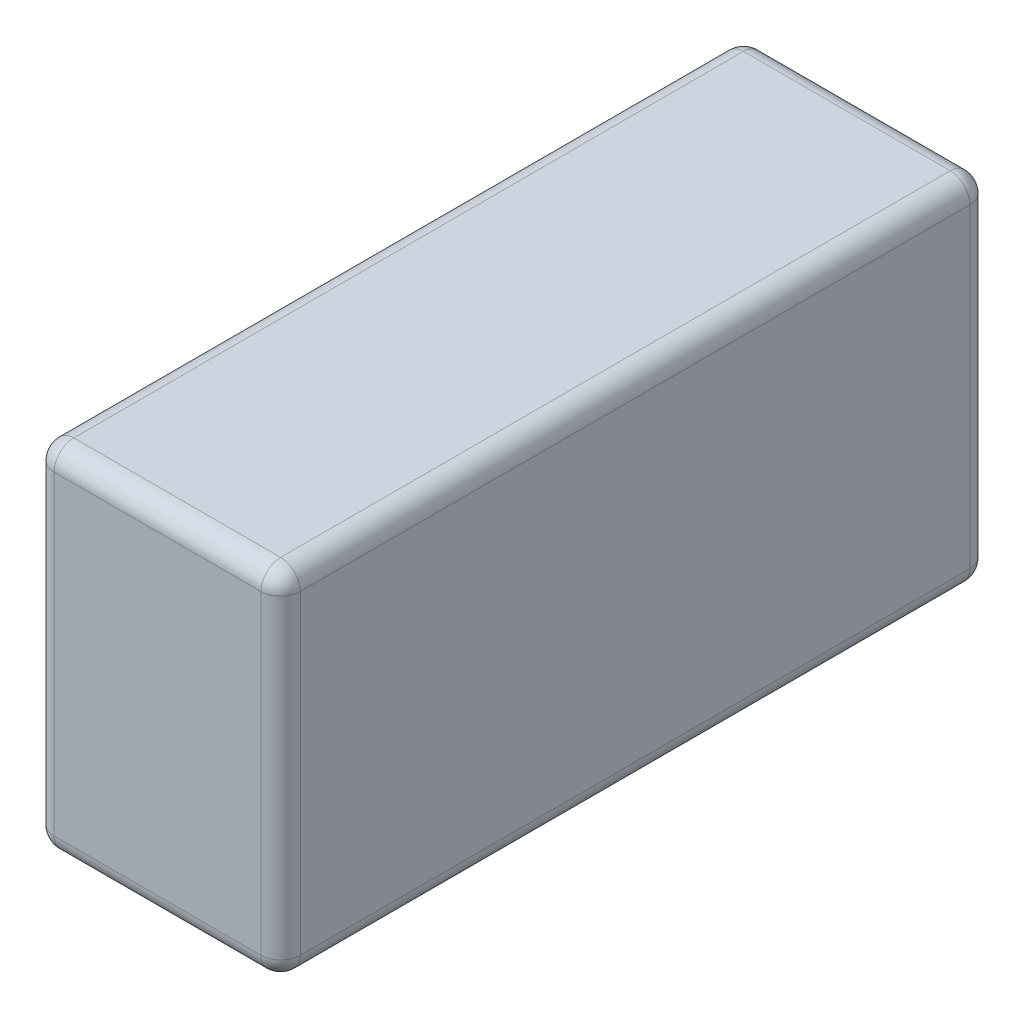
ISO-10303-21;
HEADER;
FILE_DESCRIPTION(('STEP AP214'),'2;1');
FILE_NAME('part.step','',(''),(''),'','','');
FILE_SCHEMA(('AUTOMOTIVE_DESIGN { 1 0 10303 214 1 1 1 1 }'));
ENDSEC;
DATA;
#1=APPLICATION_CONTEXT('core data for automotive mechanical design processes');
#2=APPLICATION_PROTOCOL_DEFINITION('international standard','automotive_design',2000,#1);
#3=PRODUCT_CONTEXT('',#1,'mechanical');
#4=PRODUCT('Part','Part','',(#3));
#5=PRODUCT_RELATED_PRODUCT_CATEGORY('part','',(#4));
#6=PRODUCT_DEFINITION_FORMATION('','',#4);
#7=PRODUCT_DEFINITION_CONTEXT('part definition',#1,'design');
#8=PRODUCT_DEFINITION('design','',#6,#7);
#9=PRODUCT_DEFINITION_SHAPE('','',#8);
#10=(LENGTH_UNIT() NAMED_UNIT(*) SI_UNIT(.MILLI.,.METRE.));
#11=(NAMED_UNIT(*) PLANE_ANGLE_UNIT() SI_UNIT($,.RADIAN.));
#12=(NAMED_UNIT(*) SI_UNIT($,.STERADIAN.) SOLID_ANGLE_UNIT());
#13=UNCERTAINTY_MEASURE_WITH_UNIT(LENGTH_MEASURE(1.E-05),#10,'distance_accuracy_value','');
#14=(GEOMETRIC_REPRESENTATION_CONTEXT(3) GLOBAL_UNCERTAINTY_ASSIGNED_CONTEXT((#13)) GLOBAL_UNIT_ASSIGNED_CONTEXT((#10,
#11,#12)) REPRESENTATION_CONTEXT('',''));
#15=CARTESIAN_POINT('',(0.,0.,0.));
#16=DIRECTION('',(0.,0.,1.));
#17=DIRECTION('',(1.,0.,0.));
#18=AXIS2_PLACEMENT_3D('',#15,#16,#17);
#19=CARTESIAN_POINT('',(12.5,18.,72.));
#20=DIRECTION('',(-1.,0.,0.));
#21=DIRECTION('',(0.,-1.,0.));
#22=AXIS2_PLACEMENT_3D('',#19,#20,#21);
#23=PLANE('',#22);
#24=DIRECTION('',(0.,0.,-1.));
#25=VECTOR('',#24,1.);
#26=CARTESIAN_POINT('',(12.5,16.,72.));
#27=LINE('',#26,#25);
#28=CARTESIAN_POINT('',(12.5,16.,2.));
#29=VERTEX_POINT('',#28);
#30=CARTESIAN_POINT('',(12.5,16.,70.));
#31=VERTEX_POINT('',#30);
#32=EDGE_CURVE('E209',#29,#31,#27,.F.);
#33=ORIENTED_EDGE('',*,*,#32,.T.);
#34=DIRECTION('',(0.,1.,0.));
#35=VECTOR('',#34,1.);
#36=CARTESIAN_POINT('',(12.5,-18.,70.));
#37=LINE('',#36,#35);
#38=CARTESIAN_POINT('',(12.5,-16.,70.));
#39=VERTEX_POINT('',#38);
#40=EDGE_CURVE('E218',#31,#39,#37,.F.);
#41=ORIENTED_EDGE('',*,*,#40,.T.);
#42=DIRECTION('',(0.,0.,-1.));
#43=VECTOR('',#42,1.);
#44=CARTESIAN_POINT('',(12.5,-16.,72.));
#45=LINE('',#44,#43);
#46=CARTESIAN_POINT('',(12.5,-16.,2.));
#47=VERTEX_POINT('',#46);
#48=EDGE_CURVE('E215',#39,#47,#45,.T.);
#49=ORIENTED_EDGE('',*,*,#48,.T.);
#50=DIRECTION('',(0.,1.,0.));
#51=VECTOR('',#50,1.);
#52=CARTESIAN_POINT('',(12.5,18.,2.));
#53=LINE('',#52,#51);
#54=EDGE_CURVE('E212',#47,#29,#53,.T.);
#55=ORIENTED_EDGE('',*,*,#54,.T.);
#56=EDGE_LOOP('',(#33,#41,#49,#55));
#57=FACE_BOUND('',#56,.T.);
#58=ADVANCED_FACE('F39',(#57),#23,.F.);
#59=CARTESIAN_POINT('',(-12.5,18.,72.));
#60=DIRECTION('',(0.,-1.,0.));
#61=DIRECTION('',(0.,0.,-1.));
#62=AXIS2_PLACEMENT_3D('',#59,#60,#61);
#63=PLANE('',#62);
#64=DIRECTION('',(0.,0.,-1.));
#65=VECTOR('',#64,1.);
#66=CARTESIAN_POINT('',(-10.5,18.,72.));
#67=LINE('',#66,#65);
#68=CARTESIAN_POINT('',(-10.5,18.,2.));
#69=VERTEX_POINT('',#68);
#70=CARTESIAN_POINT('',(-10.5,18.,70.));
#71=VERTEX_POINT('',#70);
#72=EDGE_CURVE('E202',#69,#71,#67,.F.);
#73=ORIENTED_EDGE('',*,*,#72,.T.);
#74=DIRECTION('',(-1.,0.,0.));
#75=VECTOR('',#74,1.);
#76=CARTESIAN_POINT('',(12.5,18.,70.));
#77=LINE('',#76,#75);
#78=CARTESIAN_POINT('',(10.5,18.,70.));
#79=VERTEX_POINT('',#78);
#80=EDGE_CURVE('E205',#71,#79,#77,.F.);
#81=ORIENTED_EDGE('',*,*,#80,.T.);
#82=DIRECTION('',(0.,0.,-1.));
#83=VECTOR('',#82,1.);
#84=CARTESIAN_POINT('',(10.5,18.,72.));
#85=LINE('',#84,#83);
#86=CARTESIAN_POINT('',(10.5,18.,2.));
#87=VERTEX_POINT('',#86);
#88=EDGE_CURVE('E199',#79,#87,#85,.T.);
#89=ORIENTED_EDGE('',*,*,#88,.T.);
#90=DIRECTION('',(-1.,0.,0.));
#91=VECTOR('',#90,1.);
#92=CARTESIAN_POINT('',(-12.5,18.,2.));
#93=LINE('',#92,#91);
#94=EDGE_CURVE('E196',#87,#69,#93,.T.);
#95=ORIENTED_EDGE('',*,*,#94,.T.);
#96=EDGE_LOOP('',(#73,#81,#89,#95));
#97=FACE_BOUND('',#96,.T.);
#98=ADVANCED_FACE('F351',(#97),#63,.F.);
#99=CARTESIAN_POINT('',(-12.5,18.,72.));
#100=DIRECTION('',(1.,0.,0.));
#101=DIRECTION('',(0.,1.,0.));
#102=AXIS2_PLACEMENT_3D('',#99,#100,#101);
#103=PLANE('',#102);
#104=DIRECTION('',(0.,0.,-1.));
#105=VECTOR('',#104,1.);
#106=CARTESIAN_POINT('',(-12.5,-16.,72.));
#107=LINE('',#106,#105);
#108=CARTESIAN_POINT('',(-12.5,-16.,2.));
#109=VERTEX_POINT('',#108);
#110=CARTESIAN_POINT('',(-12.5,-16.,70.));
#111=VERTEX_POINT('',#110);
#112=EDGE_CURVE('E189',#109,#111,#107,.F.);
#113=ORIENTED_EDGE('',*,*,#112,.T.);
#114=DIRECTION('',(0.,-1.,0.));
#115=VECTOR('',#114,1.);
#116=CARTESIAN_POINT('',(-12.5,18.,70.));
#117=LINE('',#116,#115);
#118=CARTESIAN_POINT('',(-12.5,16.,70.));
#119=VERTEX_POINT('',#118);
#120=EDGE_CURVE('E192',#111,#119,#117,.F.);
#121=ORIENTED_EDGE('',*,*,#120,.T.);
#122=DIRECTION('',(0.,0.,-1.));
#123=VECTOR('',#122,1.);
#124=CARTESIAN_POINT('',(-12.5,16.,72.));
#125=LINE('',#124,#123);
#126=CARTESIAN_POINT('',(-12.5,16.,2.));
#127=VERTEX_POINT('',#126);
#128=EDGE_CURVE('E186',#119,#127,#125,.T.);
#129=ORIENTED_EDGE('',*,*,#128,.T.);
#130=DIRECTION('',(0.,-1.,0.));
#131=VECTOR('',#130,1.);
#132=CARTESIAN_POINT('',(-12.5,18.,2.));
#133=LINE('',#132,#131);
#134=EDGE_CURVE('E183',#127,#109,#133,.T.);
#135=ORIENTED_EDGE('',*,*,#134,.T.);
#136=EDGE_LOOP('',(#113,#121,#129,#135));
#137=FACE_BOUND('',#136,.T.);
#138=ADVANCED_FACE('F337',(#137),#103,.F.);
#139=CARTESIAN_POINT('',(-12.5,-18.,72.));
#140=DIRECTION('',(0.,1.,0.));
#141=DIRECTION('',(0.,0.,1.));
#142=AXIS2_PLACEMENT_3D('',#139,#140,#141);
#143=PLANE('',#142);
#144=DIRECTION('',(0.,0.,-1.));
#145=VECTOR('',#144,1.);
#146=CARTESIAN_POINT('',(10.5,-18.,72.));
#147=LINE('',#146,#145);
#148=CARTESIAN_POINT('',(10.5,-18.,2.));
#149=VERTEX_POINT('',#148);
#150=CARTESIAN_POINT('',(10.5,-18.,70.));
#151=VERTEX_POINT('',#150);
#152=EDGE_CURVE('E167',#149,#151,#147,.F.);
#153=ORIENTED_EDGE('',*,*,#152,.T.);
#154=DIRECTION('',(1.,0.,0.));
#155=VECTOR('',#154,1.);
#156=CARTESIAN_POINT('',(-12.5,-18.,70.));
#157=LINE('',#156,#155);
#158=CARTESIAN_POINT('',(-10.5,-18.,70.));
#159=VERTEX_POINT('',#158);
#160=EDGE_CURVE('E135',#151,#159,#157,.F.);
#161=ORIENTED_EDGE('',*,*,#160,.T.);
#162=DIRECTION('',(0.,0.,-1.));
#163=VECTOR('',#162,1.);
#164=CARTESIAN_POINT('',(-10.5,-18.,72.));
#165=LINE('',#164,#163);
#166=CARTESIAN_POINT('',(-10.5,-18.,2.));
#167=VERTEX_POINT('',#166);
#168=EDGE_CURVE('E178',#159,#167,#165,.T.);
#169=ORIENTED_EDGE('',*,*,#168,.T.);
#170=DIRECTION('',(1.,0.,0.));
#171=VECTOR('',#170,1.);
#172=CARTESIAN_POINT('',(-12.5,-18.,2.));
#173=LINE('',#172,#171);
#174=EDGE_CURVE('E171',#167,#149,#173,.T.);
#175=ORIENTED_EDGE('',*,*,#174,.T.);
#176=EDGE_LOOP('',(#153,#161,#169,#175));
#177=FACE_BOUND('',#176,.T.);
#178=ADVANCED_FACE('F372',(#177),#143,.F.);
#179=CARTESIAN_POINT('',(0.,0.,72.));
#180=DIRECTION('',(0.,0.,1.));
#181=DIRECTION('',(1.,0.,0.));
#182=AXIS2_PLACEMENT_3D('',#179,#180,#181);
#183=PLANE('',#182);
#184=DIRECTION('',(0.,-1.,0.));
#185=VECTOR('',#184,1.);
#186=CARTESIAN_POINT('',(-10.5,-18.,72.));
#187=LINE('',#186,#185);
#188=CARTESIAN_POINT('',(-10.5,16.,72.));
#189=VERTEX_POINT('',#188);
#190=CARTESIAN_POINT('',(-10.5,-16.,72.));
#191=VERTEX_POINT('',#190);
#192=EDGE_CURVE('E164',#189,#191,#187,.T.);
#193=ORIENTED_EDGE('',*,*,#192,.T.);
#194=DIRECTION('',(1.,0.,0.));
#195=VECTOR('',#194,1.);
#196=CARTESIAN_POINT('',(12.5,-16.,72.));
#197=LINE('',#196,#195);
#198=CARTESIAN_POINT('',(10.5,-16.,72.));
#199=VERTEX_POINT('',#198);
#200=EDGE_CURVE('E133',#191,#199,#197,.T.);
#201=ORIENTED_EDGE('',*,*,#200,.T.);
#202=DIRECTION('',(0.,1.,0.));
#203=VECTOR('',#202,1.);
#204=CARTESIAN_POINT('',(10.5,18.,72.));
#205=LINE('',#204,#203);
#206=CARTESIAN_POINT('',(10.5,16.,72.));
#207=VERTEX_POINT('',#206);
#208=EDGE_CURVE('E153',#199,#207,#205,.T.);
#209=ORIENTED_EDGE('',*,*,#208,.T.);
#210=DIRECTION('',(-1.,0.,0.));
#211=VECTOR('',#210,1.);
#212=CARTESIAN_POINT('',(-12.5,16.,72.));
#213=LINE('',#212,#211);
#214=EDGE_CURVE('E160',#207,#189,#213,.T.);
#215=ORIENTED_EDGE('',*,*,#214,.T.);
#216=EDGE_LOOP('',(#193,#201,#209,#215));
#217=FACE_BOUND('',#216,.T.);
#218=ADVANCED_FACE('F162',(#217),#183,.T.);
#219=CARTESIAN_POINT('',(0.,0.,0.));
#220=DIRECTION('',(0.,0.,1.));
#221=DIRECTION('',(1.,0.,0.));
#222=AXIS2_PLACEMENT_3D('',#219,#220,#221);
#223=PLANE('',#222);
#224=DIRECTION('',(1.,0.,0.));
#225=VECTOR('',#224,1.);
#226=CARTESIAN_POINT('',(0.,-16.,0.));
#227=LINE('',#226,#225);
#228=CARTESIAN_POINT('',(10.5,-16.,0.));
#229=VERTEX_POINT('',#228);
#230=CARTESIAN_POINT('',(-10.5,-16.,0.));
#231=VERTEX_POINT('',#230);
#232=EDGE_CURVE('E49',#229,#231,#227,.F.);
#233=ORIENTED_EDGE('',*,*,#232,.T.);
#234=DIRECTION('',(0.,-1.,0.));
#235=VECTOR('',#234,1.);
#236=CARTESIAN_POINT('',(-10.5,0.,0.));
#237=LINE('',#236,#235);
#238=CARTESIAN_POINT('',(-10.5,16.,0.));
#239=VERTEX_POINT('',#238);
#240=EDGE_CURVE('E11',#231,#239,#237,.F.);
#241=ORIENTED_EDGE('',*,*,#240,.T.);
#242=DIRECTION('',(-1.,0.,0.));
#243=VECTOR('',#242,1.);
#244=CARTESIAN_POINT('',(0.,16.,0.));
#245=LINE('',#244,#243);
#246=CARTESIAN_POINT('',(10.5,16.,0.));
#247=VERTEX_POINT('',#246);
#248=EDGE_CURVE('E222',#239,#247,#245,.F.);
#249=ORIENTED_EDGE('',*,*,#248,.T.);
#250=DIRECTION('',(0.,1.,0.));
#251=VECTOR('',#250,1.);
#252=CARTESIAN_POINT('',(10.5,0.,0.));
#253=LINE('',#252,#251);
#254=EDGE_CURVE('E60',#247,#229,#253,.F.);
#255=ORIENTED_EDGE('',*,*,#254,.T.);
#256=EDGE_LOOP('',(#233,#241,#249,#255));
#257=FACE_BOUND('',#256,.T.);
#258=ADVANCED_FACE('F317',(#257),#223,.F.);
#259=CARTESIAN_POINT('',(-12.5,16.,2.));
#260=DIRECTION('',(-1.,0.,0.));
#261=DIRECTION('',(0.,0.,1.));
#262=AXIS2_PLACEMENT_3D('',#259,#260,#261);
#263=CYLINDRICAL_SURFACE('',#262,2.);
#264=CARTESIAN_POINT('',(-10.5,16.,2.));
#265=DIRECTION('',(-1.,0.,0.));
#266=DIRECTION('',(0.,0.,1.));
#267=AXIS2_PLACEMENT_3D('',#264,#265,#266);
#268=CIRCLE('',#267,2.);
#269=EDGE_CURVE('E43',#69,#239,#268,.T.);
#270=ORIENTED_EDGE('',*,*,#269,.F.);
#271=ORIENTED_EDGE('',*,*,#94,.F.);
#272=CARTESIAN_POINT('',(10.5,16.,2.));
#273=DIRECTION('',(1.,0.,0.));
#274=DIRECTION('',(0.,1.,0.));
#275=AXIS2_PLACEMENT_3D('',#272,#273,#274);
#276=CIRCLE('',#275,2.);
#277=EDGE_CURVE('E298',#247,#87,#276,.T.);
#278=ORIENTED_EDGE('',*,*,#277,.F.);
#279=ORIENTED_EDGE('',*,*,#248,.F.);
#280=EDGE_LOOP('',(#270,#271,#278,#279));
#281=FACE_BOUND('',#280,.T.);
#282=ADVANCED_FACE('F41',(#281),#263,.T.);
#283=CARTESIAN_POINT('',(-10.5,16.,2.));
#284=DIRECTION('',(0.,0.,1.));
#285=DIRECTION('',(1.,0.,0.));
#286=AXIS2_PLACEMENT_3D('',#283,#284,#285);
#287=SPHERICAL_SURFACE('',#286,2.);
#288=CARTESIAN_POINT('',(-10.5,16.,2.));
#289=DIRECTION('',(0.,0.,-1.));
#290=DIRECTION('',(-1.,0.,0.));
#291=AXIS2_PLACEMENT_3D('',#288,#289,#290);
#292=CIRCLE('',#291,2.);
#293=EDGE_CURVE('E292',#69,#127,#292,.F.);
#294=ORIENTED_EDGE('',*,*,#293,.F.);
#295=ORIENTED_EDGE('',*,*,#269,.T.);
#296=CARTESIAN_POINT('',(-10.5,16.,2.));
#297=DIRECTION('',(0.,1.,0.));
#298=DIRECTION('',(0.,0.,1.));
#299=AXIS2_PLACEMENT_3D('',#296,#297,#298);
#300=CIRCLE('',#299,2.);
#301=EDGE_CURVE('E296',#127,#239,#300,.F.);
#302=ORIENTED_EDGE('',*,*,#301,.F.);
#303=EDGE_LOOP('',(#294,#295,#302));
#304=FACE_BOUND('',#303,.T.);
#305=ADVANCED_FACE('F312',(#304),#287,.T.);
#306=CARTESIAN_POINT('',(10.5,16.,2.));
#307=DIRECTION('',(0.,0.,1.));
#308=DIRECTION('',(1.,0.,0.));
#309=AXIS2_PLACEMENT_3D('',#306,#307,#308);
#310=SPHERICAL_SURFACE('',#309,2.);
#311=CARTESIAN_POINT('',(10.5,16.,2.));
#312=DIRECTION('',(0.,1.,0.));
#313=DIRECTION('',(0.,0.,1.));
#314=AXIS2_PLACEMENT_3D('',#311,#312,#313);
#315=CIRCLE('',#314,2.);
#316=EDGE_CURVE('E284',#247,#29,#315,.F.);
#317=ORIENTED_EDGE('',*,*,#316,.F.);
#318=ORIENTED_EDGE('',*,*,#277,.T.);
#319=CARTESIAN_POINT('',(10.5,16.,2.));
#320=DIRECTION('',(0.,0.,-1.));
#321=DIRECTION('',(-1.,0.,0.));
#322=AXIS2_PLACEMENT_3D('',#319,#320,#321);
#323=CIRCLE('',#322,2.);
#324=EDGE_CURVE('E288',#29,#87,#323,.F.);
#325=ORIENTED_EDGE('',*,*,#324,.F.);
#326=EDGE_LOOP('',(#317,#318,#325));
#327=FACE_BOUND('',#326,.T.);
#328=ADVANCED_FACE('F361',(#327),#310,.T.);
#329=CARTESIAN_POINT('',(-10.5,18.,2.));
#330=DIRECTION('',(0.,-1.,0.));
#331=DIRECTION('',(1.,0.,0.));
#332=AXIS2_PLACEMENT_3D('',#329,#330,#331);
#333=CYLINDRICAL_SURFACE('',#332,2.);
#334=ORIENTED_EDGE('',*,*,#301,.T.);
#335=ORIENTED_EDGE('',*,*,#240,.F.);
#336=CARTESIAN_POINT('',(-10.5,-16.,2.));
#337=DIRECTION('',(0.,-1.,0.));
#338=DIRECTION('',(0.,0.,-1.));
#339=AXIS2_PLACEMENT_3D('',#336,#337,#338);
#340=CIRCLE('',#339,2.);
#341=EDGE_CURVE('E276',#109,#231,#340,.T.);
#342=ORIENTED_EDGE('',*,*,#341,.F.);
#343=ORIENTED_EDGE('',*,*,#134,.F.);
#344=EDGE_LOOP('',(#334,#335,#342,#343));
#345=FACE_BOUND('',#344,.T.);
#346=ADVANCED_FACE('F321',(#345),#333,.T.);
#347=CARTESIAN_POINT('',(-10.5,16.,72.));
#348=DIRECTION('',(0.,0.,-1.));
#349=DIRECTION('',(-1.,0.,0.));
#350=AXIS2_PLACEMENT_3D('',#347,#348,#349);
#351=CYLINDRICAL_SURFACE('',#350,2.);
#352=ORIENTED_EDGE('',*,*,#293,.T.);
#353=ORIENTED_EDGE('',*,*,#128,.F.);
#354=CARTESIAN_POINT('',(-10.5,16.,70.));
#355=DIRECTION('',(0.,0.,1.));
#356=DIRECTION('',(1.,0.,0.));
#357=AXIS2_PLACEMENT_3D('',#354,#355,#356);
#358=CIRCLE('',#357,2.);
#359=EDGE_CURVE('E272',#71,#119,#358,.T.);
#360=ORIENTED_EDGE('',*,*,#359,.F.);
#361=ORIENTED_EDGE('',*,*,#72,.F.);
#362=EDGE_LOOP('',(#352,#353,#360,#361));
#363=FACE_BOUND('',#362,.T.);
#364=ADVANCED_FACE('F348',(#363),#351,.T.);
#365=CARTESIAN_POINT('',(0.,16.,70.));
#366=DIRECTION('',(1.,0.,0.));
#367=DIRECTION('',(0.,0.,-1.));
#368=AXIS2_PLACEMENT_3D('',#365,#366,#367);
#369=CYLINDRICAL_SURFACE('',#368,2.);
#370=CARTESIAN_POINT('',(10.5,16.,70.));
#371=DIRECTION('',(1.,0.,0.));
#372=DIRECTION('',(0.,0.,-1.));
#373=AXIS2_PLACEMENT_3D('',#370,#371,#372);
#374=CIRCLE('',#373,2.);
#375=EDGE_CURVE('E264',#79,#207,#374,.T.);
#376=ORIENTED_EDGE('',*,*,#375,.F.);
#377=ORIENTED_EDGE('',*,*,#80,.F.);
#378=CARTESIAN_POINT('',(-10.5,16.,70.));
#379=DIRECTION('',(-1.,0.,0.));
#380=DIRECTION('',(0.,0.,1.));
#381=AXIS2_PLACEMENT_3D('',#378,#379,#380);
#382=CIRCLE('',#381,2.);
#383=EDGE_CURVE('E268',#189,#71,#382,.T.);
#384=ORIENTED_EDGE('',*,*,#383,.F.);
#385=ORIENTED_EDGE('',*,*,#214,.F.);
#386=EDGE_LOOP('',(#376,#377,#384,#385));
#387=FACE_BOUND('',#386,.T.);
#388=ADVANCED_FACE('F354',(#387),#369,.T.);
#389=CARTESIAN_POINT('',(10.5,16.,72.));
#390=DIRECTION('',(0.,0.,-1.));
#391=DIRECTION('',(-1.,0.,0.));
#392=AXIS2_PLACEMENT_3D('',#389,#390,#391);
#393=CYLINDRICAL_SURFACE('',#392,2.);
#394=ORIENTED_EDGE('',*,*,#324,.T.);
#395=ORIENTED_EDGE('',*,*,#88,.F.);
#396=CARTESIAN_POINT('',(10.5,16.,70.));
#397=DIRECTION('',(0.,0.,1.));
#398=DIRECTION('',(1.,0.,0.));
#399=AXIS2_PLACEMENT_3D('',#396,#397,#398);
#400=CIRCLE('',#399,2.);
#401=EDGE_CURVE('E261',#31,#79,#400,.T.);
#402=ORIENTED_EDGE('',*,*,#401,.F.);
#403=ORIENTED_EDGE('',*,*,#32,.F.);
#404=EDGE_LOOP('',(#394,#395,#402,#403));
#405=FACE_BOUND('',#404,.T.);
#406=ADVANCED_FACE('F359',(#405),#393,.T.);
#407=CARTESIAN_POINT('',(10.5,18.,2.));
#408=DIRECTION('',(0.,1.,0.));
#409=DIRECTION('',(-1.,0.,0.));
#410=AXIS2_PLACEMENT_3D('',#407,#408,#409);
#411=CYLINDRICAL_SURFACE('',#410,2.);
#412=ORIENTED_EDGE('',*,*,#316,.T.);
#413=ORIENTED_EDGE('',*,*,#54,.F.);
#414=CARTESIAN_POINT('',(10.5,-16.,2.));
#415=DIRECTION('',(0.,-1.,0.));
#416=DIRECTION('',(1.,0.,0.));
#417=AXIS2_PLACEMENT_3D('',#414,#415,#416);
#418=CIRCLE('',#417,2.);
#419=EDGE_CURVE('E257',#229,#47,#418,.T.);
#420=ORIENTED_EDGE('',*,*,#419,.F.);
#421=ORIENTED_EDGE('',*,*,#254,.F.);
#422=EDGE_LOOP('',(#412,#413,#420,#421));
#423=FACE_BOUND('',#422,.T.);
#424=ADVANCED_FACE('F364',(#423),#411,.T.);
#425=CARTESIAN_POINT('',(-12.5,-16.,2.));
#426=DIRECTION('',(1.,0.,0.));
#427=DIRECTION('',(0.,0.,-1.));
#428=AXIS2_PLACEMENT_3D('',#425,#426,#427);
#429=CYLINDRICAL_SURFACE('',#428,2.);
#430=CARTESIAN_POINT('',(-10.5,-16.,2.));
#431=DIRECTION('',(-1.,0.,0.));
#432=DIRECTION('',(0.,0.,1.));
#433=AXIS2_PLACEMENT_3D('',#430,#431,#432);
#434=CIRCLE('',#433,2.);
#435=EDGE_CURVE('E280',#231,#167,#434,.T.);
#436=ORIENTED_EDGE('',*,*,#435,.F.);
#437=ORIENTED_EDGE('',*,*,#232,.F.);
#438=CARTESIAN_POINT('',(10.5,-16.,2.));
#439=DIRECTION('',(1.,0.,0.));
#440=DIRECTION('',(0.,0.,-1.));
#441=AXIS2_PLACEMENT_3D('',#438,#439,#440);
#442=CIRCLE('',#441,2.);
#443=EDGE_CURVE('E253',#149,#229,#442,.T.);
#444=ORIENTED_EDGE('',*,*,#443,.F.);
#445=ORIENTED_EDGE('',*,*,#174,.F.);
#446=EDGE_LOOP('',(#436,#437,#444,#445));
#447=FACE_BOUND('',#446,.T.);
#448=ADVANCED_FACE('F325',(#447),#429,.T.);
#449=CARTESIAN_POINT('',(-10.5,-16.,2.));
#450=DIRECTION('',(0.,0.,1.));
#451=DIRECTION('',(1.,0.,0.));
#452=AXIS2_PLACEMENT_3D('',#449,#450,#451);
#453=SPHERICAL_SURFACE('',#452,2.);
#454=ORIENTED_EDGE('',*,*,#341,.T.);
#455=ORIENTED_EDGE('',*,*,#435,.T.);
#456=CARTESIAN_POINT('',(-10.5,-16.,2.));
#457=DIRECTION('',(0.,0.,-1.));
#458=DIRECTION('',(-1.,0.,0.));
#459=AXIS2_PLACEMENT_3D('',#456,#457,#458);
#460=CIRCLE('',#459,2.);
#461=EDGE_CURVE('E249',#109,#167,#460,.F.);
#462=ORIENTED_EDGE('',*,*,#461,.F.);
#463=EDGE_LOOP('',(#454,#455,#462));
#464=FACE_BOUND('',#463,.T.);
#465=ADVANCED_FACE('F329',(#464),#453,.T.);
#466=CARTESIAN_POINT('',(-10.5,16.,70.));
#467=DIRECTION('',(0.,0.,1.));
#468=DIRECTION('',(1.,0.,0.));
#469=AXIS2_PLACEMENT_3D('',#466,#467,#468);
#470=SPHERICAL_SURFACE('',#469,2.);
#471=ORIENTED_EDGE('',*,*,#383,.T.);
#472=ORIENTED_EDGE('',*,*,#359,.T.);
#473=CARTESIAN_POINT('',(-10.5,16.,70.));
#474=DIRECTION('',(0.,1.,0.));
#475=DIRECTION('',(0.,0.,1.));
#476=AXIS2_PLACEMENT_3D('',#473,#474,#475);
#477=CIRCLE('',#476,2.);
#478=EDGE_CURVE('E246',#189,#119,#477,.F.);
#479=ORIENTED_EDGE('',*,*,#478,.F.);
#480=EDGE_LOOP('',(#471,#472,#479));
#481=FACE_BOUND('',#480,.T.);
#482=ADVANCED_FACE('F345',(#481),#470,.T.);
#483=CARTESIAN_POINT('',(10.5,16.,70.));
#484=DIRECTION('',(0.,0.,1.));
#485=DIRECTION('',(1.,0.,0.));
#486=AXIS2_PLACEMENT_3D('',#483,#484,#485);
#487=SPHERICAL_SURFACE('',#486,2.);
#488=ORIENTED_EDGE('',*,*,#401,.T.);
#489=ORIENTED_EDGE('',*,*,#375,.T.);
#490=CARTESIAN_POINT('',(10.5,16.,70.));
#491=DIRECTION('',(0.,1.,0.));
#492=DIRECTION('',(0.,0.,1.));
#493=AXIS2_PLACEMENT_3D('',#490,#491,#492);
#494=CIRCLE('',#493,2.);
#495=EDGE_CURVE('E156',#31,#207,#494,.F.);
#496=ORIENTED_EDGE('',*,*,#495,.F.);
#497=EDGE_LOOP('',(#488,#489,#496));
#498=FACE_BOUND('',#497,.T.);
#499=ADVANCED_FACE('F408',(#498),#487,.T.);
#500=CARTESIAN_POINT('',(10.5,-16.,2.));
#501=DIRECTION('',(0.,0.,1.));
#502=DIRECTION('',(1.,0.,0.));
#503=AXIS2_PLACEMENT_3D('',#500,#501,#502);
#504=SPHERICAL_SURFACE('',#503,2.);
#505=ORIENTED_EDGE('',*,*,#443,.T.);
#506=ORIENTED_EDGE('',*,*,#419,.T.);
#507=CARTESIAN_POINT('',(10.5,-16.,2.));
#508=DIRECTION('',(0.,0.,-1.));
#509=DIRECTION('',(-1.,0.,0.));
#510=AXIS2_PLACEMENT_3D('',#507,#508,#509);
#511=CIRCLE('',#510,2.);
#512=EDGE_CURVE('E240',#149,#47,#511,.F.);
#513=ORIENTED_EDGE('',*,*,#512,.F.);
#514=EDGE_LOOP('',(#505,#506,#513));
#515=FACE_BOUND('',#514,.T.);
#516=ADVANCED_FACE('F367',(#515),#504,.T.);
#517=CARTESIAN_POINT('',(-10.5,-16.,72.));
#518=DIRECTION('',(0.,0.,-1.));
#519=DIRECTION('',(-1.,0.,0.));
#520=AXIS2_PLACEMENT_3D('',#517,#518,#519);
#521=CYLINDRICAL_SURFACE('',#520,2.);
#522=ORIENTED_EDGE('',*,*,#461,.T.);
#523=ORIENTED_EDGE('',*,*,#168,.F.);
#524=CARTESIAN_POINT('',(-10.5,-16.,70.));
#525=DIRECTION('',(0.,0.,1.));
#526=DIRECTION('',(1.,0.,0.));
#527=AXIS2_PLACEMENT_3D('',#524,#525,#526);
#528=CIRCLE('',#527,2.);
#529=EDGE_CURVE('E236',#111,#159,#528,.T.);
#530=ORIENTED_EDGE('',*,*,#529,.F.);
#531=ORIENTED_EDGE('',*,*,#112,.F.);
#532=EDGE_LOOP('',(#522,#523,#530,#531));
#533=FACE_BOUND('',#532,.T.);
#534=ADVANCED_FACE('F334',(#533),#521,.T.);
#535=CARTESIAN_POINT('',(-10.5,0.,70.));
#536=DIRECTION('',(0.,1.,0.));
#537=DIRECTION('',(-1.,0.,0.));
#538=AXIS2_PLACEMENT_3D('',#535,#536,#537);
#539=CYLINDRICAL_SURFACE('',#538,2.);
#540=ORIENTED_EDGE('',*,*,#478,.T.);
#541=ORIENTED_EDGE('',*,*,#120,.F.);
#542=CARTESIAN_POINT('',(-10.5,-16.,70.));
#543=DIRECTION('',(0.,-1.,0.));
#544=DIRECTION('',(0.,0.,-1.));
#545=AXIS2_PLACEMENT_3D('',#542,#543,#544);
#546=CIRCLE('',#545,2.);
#547=EDGE_CURVE('E150',#191,#111,#546,.T.);
#548=ORIENTED_EDGE('',*,*,#547,.F.);
#549=ORIENTED_EDGE('',*,*,#192,.F.);
#550=EDGE_LOOP('',(#540,#541,#548,#549));
#551=FACE_BOUND('',#550,.T.);
#552=ADVANCED_FACE('F339',(#551),#539,.T.);
#553=CARTESIAN_POINT('',(10.5,0.,70.));
#554=DIRECTION('',(0.,-1.,0.));
#555=DIRECTION('',(1.,0.,0.));
#556=AXIS2_PLACEMENT_3D('',#553,#554,#555);
#557=CYLINDRICAL_SURFACE('',#556,2.);
#558=ORIENTED_EDGE('',*,*,#495,.T.);
#559=ORIENTED_EDGE('',*,*,#208,.F.);
#560=CARTESIAN_POINT('',(10.5,-16.,70.));
#561=DIRECTION('',(0.,-1.,0.));
#562=DIRECTION('',(0.,0.,-1.));
#563=AXIS2_PLACEMENT_3D('',#560,#561,#562);
#564=CIRCLE('',#563,2.);
#565=EDGE_CURVE('E141',#39,#199,#564,.T.);
#566=ORIENTED_EDGE('',*,*,#565,.F.);
#567=ORIENTED_EDGE('',*,*,#40,.F.);
#568=EDGE_LOOP('',(#558,#559,#566,#567));
#569=FACE_BOUND('',#568,.T.);
#570=ADVANCED_FACE('F154',(#569),#557,.T.);
#571=CARTESIAN_POINT('',(10.5,-16.,72.));
#572=DIRECTION('',(0.,0.,-1.));
#573=DIRECTION('',(-1.,0.,0.));
#574=AXIS2_PLACEMENT_3D('',#571,#572,#573);
#575=CYLINDRICAL_SURFACE('',#574,2.);
#576=ORIENTED_EDGE('',*,*,#512,.T.);
#577=ORIENTED_EDGE('',*,*,#48,.F.);
#578=CARTESIAN_POINT('',(10.5,-16.,70.));
#579=DIRECTION('',(0.,0.,1.));
#580=DIRECTION('',(1.,0.,0.));
#581=AXIS2_PLACEMENT_3D('',#578,#579,#580);
#582=CIRCLE('',#581,2.);
#583=EDGE_CURVE('E145',#151,#39,#582,.T.);
#584=ORIENTED_EDGE('',*,*,#583,.F.);
#585=ORIENTED_EDGE('',*,*,#152,.F.);
#586=EDGE_LOOP('',(#576,#577,#584,#585));
#587=FACE_BOUND('',#586,.T.);
#588=ADVANCED_FACE('F370',(#587),#575,.T.);
#589=CARTESIAN_POINT('',(-10.5,-16.,70.));
#590=DIRECTION('',(0.,0.,1.));
#591=DIRECTION('',(1.,0.,0.));
#592=AXIS2_PLACEMENT_3D('',#589,#590,#591);
#593=SPHERICAL_SURFACE('',#592,2.);
#594=ORIENTED_EDGE('',*,*,#547,.T.);
#595=ORIENTED_EDGE('',*,*,#529,.T.);
#596=CARTESIAN_POINT('',(-10.5,-16.,70.));
#597=DIRECTION('',(-1.,0.,0.));
#598=DIRECTION('',(0.,0.,1.));
#599=AXIS2_PLACEMENT_3D('',#596,#597,#598);
#600=CIRCLE('',#599,2.);
#601=EDGE_CURVE('E138',#191,#159,#600,.F.);
#602=ORIENTED_EDGE('',*,*,#601,.F.);
#603=EDGE_LOOP('',(#594,#595,#602));
#604=FACE_BOUND('',#603,.T.);
#605=ADVANCED_FACE('F394',(#604),#593,.T.);
#606=CARTESIAN_POINT('',(10.5,-16.,70.));
#607=DIRECTION('',(0.,0.,1.));
#608=DIRECTION('',(1.,0.,0.));
#609=AXIS2_PLACEMENT_3D('',#606,#607,#608);
#610=SPHERICAL_SURFACE('',#609,2.);
#611=ORIENTED_EDGE('',*,*,#583,.T.);
#612=ORIENTED_EDGE('',*,*,#565,.T.);
#613=CARTESIAN_POINT('',(10.5,-16.,70.));
#614=DIRECTION('',(1.,0.,0.));
#615=DIRECTION('',(0.,0.,-1.));
#616=AXIS2_PLACEMENT_3D('',#613,#614,#615);
#617=CIRCLE('',#616,2.);
#618=EDGE_CURVE('E129',#151,#199,#617,.F.);
#619=ORIENTED_EDGE('',*,*,#618,.F.);
#620=EDGE_LOOP('',(#611,#612,#619));
#621=FACE_BOUND('',#620,.T.);
#622=ADVANCED_FACE('F143',(#621),#610,.T.);
#623=CARTESIAN_POINT('',(0.,-16.,70.));
#624=DIRECTION('',(-1.,0.,0.));
#625=DIRECTION('',(0.,0.,1.));
#626=AXIS2_PLACEMENT_3D('',#623,#624,#625);
#627=CYLINDRICAL_SURFACE('',#626,2.);
#628=ORIENTED_EDGE('',*,*,#601,.T.);
#629=ORIENTED_EDGE('',*,*,#160,.F.);
#630=ORIENTED_EDGE('',*,*,#618,.T.);
#631=ORIENTED_EDGE('',*,*,#200,.F.);
#632=EDGE_LOOP('',(#628,#629,#630,#631));
#633=FACE_BOUND('',#632,.T.);
#634=ADVANCED_FACE('F131',(#633),#627,.T.);
#635=CLOSED_SHELL('',(#58,#98,#138,#178,#218,#258,#282,#305,#328,#346,#364,#388,#406,#424,#448,
#465,#482,#499,#516,#534,#552,#570,#588,#605,#622,#634));
#636=MANIFOLD_SOLID_BREP('B2',#635);
#637=ADVANCED_BREP_SHAPE_REPRESENTATION('',(#18,#636),#14);
#638=SHAPE_DEFINITION_REPRESENTATION(#9,#637);
ENDSEC;
END-ISO-10303-21;
